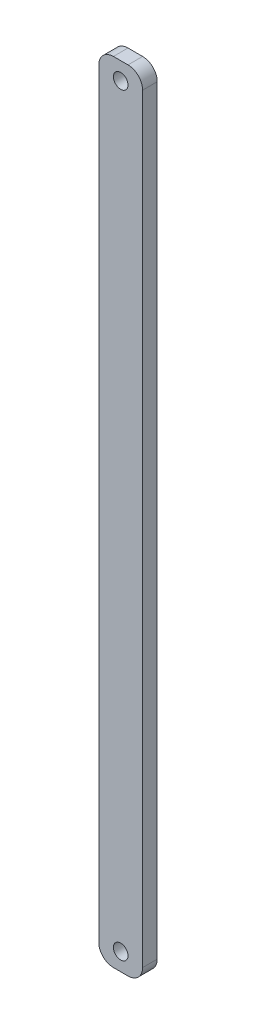
ISO-10303-21;
HEADER;
FILE_DESCRIPTION(('STEP AP214'),'2;1');
FILE_NAME('part.step','',(''),(''),'','','');
FILE_SCHEMA(('AUTOMOTIVE_DESIGN { 1 0 10303 214 1 1 1 1 }'));
ENDSEC;
DATA;
#1=APPLICATION_CONTEXT('core data for automotive mechanical design processes');
#2=APPLICATION_PROTOCOL_DEFINITION('international standard','automotive_design',2000,#1);
#3=PRODUCT_CONTEXT('',#1,'mechanical');
#4=PRODUCT('Part','Part','',(#3));
#5=PRODUCT_RELATED_PRODUCT_CATEGORY('part','',(#4));
#6=PRODUCT_DEFINITION_FORMATION('','',#4);
#7=PRODUCT_DEFINITION_CONTEXT('part definition',#1,'design');
#8=PRODUCT_DEFINITION('design','',#6,#7);
#9=PRODUCT_DEFINITION_SHAPE('','',#8);
#10=(LENGTH_UNIT() NAMED_UNIT(*) SI_UNIT(.MILLI.,.METRE.));
#11=(NAMED_UNIT(*) PLANE_ANGLE_UNIT() SI_UNIT($,.RADIAN.));
#12=(NAMED_UNIT(*) SI_UNIT($,.STERADIAN.) SOLID_ANGLE_UNIT());
#13=UNCERTAINTY_MEASURE_WITH_UNIT(LENGTH_MEASURE(1.E-05),#10,'distance_accuracy_value','');
#14=(GEOMETRIC_REPRESENTATION_CONTEXT(3) GLOBAL_UNCERTAINTY_ASSIGNED_CONTEXT((#13)) GLOBAL_UNIT_ASSIGNED_CONTEXT((#10,
#11,#12)) REPRESENTATION_CONTEXT('',''));
#15=CARTESIAN_POINT('',(0.,0.,0.));
#16=DIRECTION('',(0.,0.,1.));
#17=DIRECTION('',(1.,0.,0.));
#18=AXIS2_PLACEMENT_3D('',#15,#16,#17);
#19=CARTESIAN_POINT('',(2.00000000000001,-26.,1.));
#20=DIRECTION('',(0.,0.,-1.));
#21=DIRECTION('',(-1.,0.,0.));
#22=AXIS2_PLACEMENT_3D('',#19,#20,#21);
#23=PLANE('',#22);
#24=DIRECTION('',(1.,0.,0.));
#25=VECTOR('',#24,1.);
#26=CARTESIAN_POINT('',(1.,-27.,1.));
#27=LINE('',#26,#25);
#28=CARTESIAN_POINT('',(1.,-27.,1.));
#29=VERTEX_POINT('',#28);
#30=CARTESIAN_POINT('',(2.00000000000001,-27.,1.));
#31=VERTEX_POINT('',#30);
#32=EDGE_CURVE('E92',#29,#31,#27,.T.);
#33=ORIENTED_EDGE('',*,*,#32,.T.);
#34=CARTESIAN_POINT('',(2.00000000000001,-26.,1.));
#35=DIRECTION('',(0.,0.,1.));
#36=DIRECTION('',(-1.,0.,0.));
#37=AXIS2_PLACEMENT_3D('',#34,#35,#36);
#38=CIRCLE('',#37,1.);
#39=CARTESIAN_POINT('',(3.00000000000001,-26.,1.));
#40=VERTEX_POINT('',#39);
#41=EDGE_CURVE('E177',#31,#40,#38,.T.);
#42=ORIENTED_EDGE('',*,*,#41,.T.);
#43=DIRECTION('',(0.,1.,0.));
#44=VECTOR('',#43,1.);
#45=CARTESIAN_POINT('',(3.,26.,1.));
#46=LINE('',#45,#44);
#47=CARTESIAN_POINT('',(3.,26.,1.));
#48=VERTEX_POINT('',#47);
#49=EDGE_CURVE('E160',#40,#48,#46,.T.);
#50=ORIENTED_EDGE('',*,*,#49,.T.);
#51=CARTESIAN_POINT('',(2.,26.,1.));
#52=DIRECTION('',(0.,0.,1.));
#53=DIRECTION('',(1.,0.,0.));
#54=AXIS2_PLACEMENT_3D('',#51,#52,#53);
#55=CIRCLE('',#54,1.);
#56=CARTESIAN_POINT('',(2.,27.,1.));
#57=VERTEX_POINT('',#56);
#58=EDGE_CURVE('E173',#48,#57,#55,.T.);
#59=ORIENTED_EDGE('',*,*,#58,.T.);
#60=DIRECTION('',(-1.,0.,0.));
#61=VECTOR('',#60,1.);
#62=CARTESIAN_POINT('',(1.,27.,1.));
#63=LINE('',#62,#61);
#64=CARTESIAN_POINT('',(1.,27.,1.));
#65=VERTEX_POINT('',#64);
#66=EDGE_CURVE('E112',#57,#65,#63,.T.);
#67=ORIENTED_EDGE('',*,*,#66,.T.);
#68=CARTESIAN_POINT('',(1.,26.,1.));
#69=DIRECTION('',(0.,0.,1.));
#70=DIRECTION('',(-1.,0.,0.));
#71=AXIS2_PLACEMENT_3D('',#68,#69,#70);
#72=CIRCLE('',#71,1.);
#73=CARTESIAN_POINT('',(0.,26.,1.));
#74=VERTEX_POINT('',#73);
#75=EDGE_CURVE('E106',#65,#74,#72,.T.);
#76=ORIENTED_EDGE('',*,*,#75,.T.);
#77=DIRECTION('',(0.,-1.,0.));
#78=VECTOR('',#77,1.);
#79=CARTESIAN_POINT('',(0.,-26.,1.));
#80=LINE('',#79,#78);
#81=CARTESIAN_POINT('',(0.,-26.,1.));
#82=VERTEX_POINT('',#81);
#83=EDGE_CURVE('E110',#74,#82,#80,.T.);
#84=ORIENTED_EDGE('',*,*,#83,.T.);
#85=CARTESIAN_POINT('',(1.,-26.,1.));
#86=DIRECTION('',(0.,0.,1.));
#87=DIRECTION('',(1.,0.,0.));
#88=AXIS2_PLACEMENT_3D('',#85,#86,#87);
#89=CIRCLE('',#88,1.);
#90=EDGE_CURVE('E50',#82,#29,#89,.T.);
#91=ORIENTED_EDGE('',*,*,#90,.T.);
#92=EDGE_LOOP('',(#33,#42,#50,#59,#67,#76,#84,#91));
#93=FACE_BOUND('',#92,.T.);
#94=CARTESIAN_POINT('',(1.5,25.8,1.));
#95=DIRECTION('',(0.,0.,1.));
#96=DIRECTION('',(1.,0.,0.));
#97=AXIS2_PLACEMENT_3D('',#94,#95,#96);
#98=CIRCLE('',#97,0.5);
#99=CARTESIAN_POINT('',(2.,25.8,1.));
#100=VERTEX_POINT('',#99);
#101=EDGE_CURVE('E132',#100,#100,#98,.T.);
#102=ORIENTED_EDGE('',*,*,#101,.F.);
#103=EDGE_LOOP('',(#102));
#104=FACE_BOUND('',#103,.T.);
#105=CARTESIAN_POINT('',(1.5,-25.8,1.));
#106=DIRECTION('',(0.,0.,1.));
#107=DIRECTION('',(1.,0.,0.));
#108=AXIS2_PLACEMENT_3D('',#105,#106,#107);
#109=CIRCLE('',#108,0.5);
#110=CARTESIAN_POINT('',(2.,-25.8,1.));
#111=VERTEX_POINT('',#110);
#112=EDGE_CURVE('E183',#111,#111,#109,.T.);
#113=ORIENTED_EDGE('',*,*,#112,.F.);
#114=EDGE_LOOP('',(#113));
#115=FACE_BOUND('',#114,.T.);
#116=ADVANCED_FACE('F33',(#93,#104,#115),#23,.F.);
#117=CARTESIAN_POINT('',(2.00000000000001,-26.,0.));
#118=DIRECTION('',(0.,0.,-1.));
#119=DIRECTION('',(-1.,0.,0.));
#120=AXIS2_PLACEMENT_3D('',#117,#118,#119);
#121=PLANE('',#120);
#122=CARTESIAN_POINT('',(1.5,25.8,0.));
#123=DIRECTION('',(0.,0.,1.));
#124=DIRECTION('',(1.,0.,0.));
#125=AXIS2_PLACEMENT_3D('',#122,#123,#124);
#126=CIRCLE('',#125,0.5);
#127=CARTESIAN_POINT('',(2.,25.8,0.));
#128=VERTEX_POINT('',#127);
#129=EDGE_CURVE('E180',#128,#128,#126,.T.);
#130=ORIENTED_EDGE('',*,*,#129,.T.);
#131=EDGE_LOOP('',(#130));
#132=FACE_BOUND('',#131,.T.);
#133=DIRECTION('',(1.,0.,0.));
#134=VECTOR('',#133,1.);
#135=CARTESIAN_POINT('',(2.00000000000001,-27.,0.));
#136=LINE('',#135,#134);
#137=CARTESIAN_POINT('',(1.,-27.,0.));
#138=VERTEX_POINT('',#137);
#139=CARTESIAN_POINT('',(2.00000000000001,-27.,0.));
#140=VERTEX_POINT('',#139);
#141=EDGE_CURVE('E86',#138,#140,#136,.T.);
#142=ORIENTED_EDGE('',*,*,#141,.F.);
#143=CARTESIAN_POINT('',(1.,-26.,0.));
#144=DIRECTION('',(0.,0.,1.));
#145=DIRECTION('',(1.,0.,0.));
#146=AXIS2_PLACEMENT_3D('',#143,#144,#145);
#147=CIRCLE('',#146,1.);
#148=CARTESIAN_POINT('',(0.,-26.,0.));
#149=VERTEX_POINT('',#148);
#150=EDGE_CURVE('E142',#149,#138,#147,.T.);
#151=ORIENTED_EDGE('',*,*,#150,.F.);
#152=DIRECTION('',(0.,-1.,0.));
#153=VECTOR('',#152,1.);
#154=CARTESIAN_POINT('',(0.,-26.,0.));
#155=LINE('',#154,#153);
#156=CARTESIAN_POINT('',(0.,26.,0.));
#157=VERTEX_POINT('',#156);
#158=EDGE_CURVE('E79',#157,#149,#155,.T.);
#159=ORIENTED_EDGE('',*,*,#158,.F.);
#160=CARTESIAN_POINT('',(1.,26.,0.));
#161=DIRECTION('',(0.,0.,1.));
#162=DIRECTION('',(-1.,0.,0.));
#163=AXIS2_PLACEMENT_3D('',#160,#161,#162);
#164=CIRCLE('',#163,1.);
#165=CARTESIAN_POINT('',(1.,27.,0.));
#166=VERTEX_POINT('',#165);
#167=EDGE_CURVE('E120',#166,#157,#164,.T.);
#168=ORIENTED_EDGE('',*,*,#167,.F.);
#169=DIRECTION('',(-1.,0.,0.));
#170=VECTOR('',#169,1.);
#171=CARTESIAN_POINT('',(1.,27.,0.));
#172=LINE('',#171,#170);
#173=CARTESIAN_POINT('',(2.,27.,0.));
#174=VERTEX_POINT('',#173);
#175=EDGE_CURVE('E138',#174,#166,#172,.T.);
#176=ORIENTED_EDGE('',*,*,#175,.F.);
#177=CARTESIAN_POINT('',(2.,26.,0.));
#178=DIRECTION('',(0.,0.,1.));
#179=DIRECTION('',(1.,0.,0.));
#180=AXIS2_PLACEMENT_3D('',#177,#178,#179);
#181=CIRCLE('',#180,1.);
#182=CARTESIAN_POINT('',(3.,26.,0.));
#183=VERTEX_POINT('',#182);
#184=EDGE_CURVE('E136',#183,#174,#181,.T.);
#185=ORIENTED_EDGE('',*,*,#184,.F.);
#186=DIRECTION('',(0.,1.,0.));
#187=VECTOR('',#186,1.);
#188=CARTESIAN_POINT('',(3.,26.,0.));
#189=LINE('',#188,#187);
#190=CARTESIAN_POINT('',(3.00000000000001,-26.,0.));
#191=VERTEX_POINT('',#190);
#192=EDGE_CURVE('E134',#191,#183,#189,.T.);
#193=ORIENTED_EDGE('',*,*,#192,.F.);
#194=CARTESIAN_POINT('',(2.00000000000001,-26.,0.));
#195=DIRECTION('',(0.,0.,1.));
#196=DIRECTION('',(-1.,0.,0.));
#197=AXIS2_PLACEMENT_3D('',#194,#195,#196);
#198=CIRCLE('',#197,1.);
#199=EDGE_CURVE('E131',#140,#191,#198,.T.);
#200=ORIENTED_EDGE('',*,*,#199,.F.);
#201=EDGE_LOOP('',(#142,#151,#159,#168,#176,#185,#193,#200));
#202=FACE_BOUND('',#201,.T.);
#203=CARTESIAN_POINT('',(1.5,-25.8,0.));
#204=DIRECTION('',(0.,0.,1.));
#205=DIRECTION('',(1.,0.,0.));
#206=AXIS2_PLACEMENT_3D('',#203,#204,#205);
#207=CIRCLE('',#206,0.5);
#208=CARTESIAN_POINT('',(2.,-25.8,0.));
#209=VERTEX_POINT('',#208);
#210=EDGE_CURVE('E186',#209,#209,#207,.T.);
#211=ORIENTED_EDGE('',*,*,#210,.T.);
#212=EDGE_LOOP('',(#211));
#213=FACE_BOUND('',#212,.T.);
#214=ADVANCED_FACE('F164',(#132,#202,#213),#121,.T.);
#215=CARTESIAN_POINT('',(2.00000000000001,-27.,1.));
#216=DIRECTION('',(0.,1.,0.));
#217=DIRECTION('',(0.,0.,1.));
#218=AXIS2_PLACEMENT_3D('',#215,#216,#217);
#219=PLANE('',#218);
#220=ORIENTED_EDGE('',*,*,#141,.T.);
#221=DIRECTION('',(0.,0.,-1.));
#222=VECTOR('',#221,1.);
#223=CARTESIAN_POINT('',(2.00000000000001,-27.,1.));
#224=LINE('',#223,#222);
#225=EDGE_CURVE('E11',#31,#140,#224,.T.);
#226=ORIENTED_EDGE('',*,*,#225,.F.);
#227=ORIENTED_EDGE('',*,*,#32,.F.);
#228=DIRECTION('',(0.,0.,-1.));
#229=VECTOR('',#228,1.);
#230=CARTESIAN_POINT('',(1.,-27.,1.));
#231=LINE('',#230,#229);
#232=EDGE_CURVE('E126',#29,#138,#231,.T.);
#233=ORIENTED_EDGE('',*,*,#232,.T.);
#234=EDGE_LOOP('',(#220,#226,#227,#233));
#235=FACE_BOUND('',#234,.T.);
#236=ADVANCED_FACE('F35',(#235),#219,.F.);
#237=CARTESIAN_POINT('',(2.00000000000001,-26.,1.));
#238=DIRECTION('',(0.,0.,-1.));
#239=DIRECTION('',(-1.,0.,0.));
#240=AXIS2_PLACEMENT_3D('',#237,#238,#239);
#241=CYLINDRICAL_SURFACE('',#240,1.);
#242=ORIENTED_EDGE('',*,*,#199,.T.);
#243=DIRECTION('',(0.,0.,-1.));
#244=VECTOR('',#243,1.);
#245=CARTESIAN_POINT('',(3.00000000000001,-26.,1.));
#246=LINE('',#245,#244);
#247=EDGE_CURVE('E42',#40,#191,#246,.T.);
#248=ORIENTED_EDGE('',*,*,#247,.F.);
#249=ORIENTED_EDGE('',*,*,#41,.F.);
#250=ORIENTED_EDGE('',*,*,#225,.T.);
#251=EDGE_LOOP('',(#242,#248,#249,#250));
#252=FACE_BOUND('',#251,.T.);
#253=ADVANCED_FACE('F219',(#252),#241,.T.);
#254=CARTESIAN_POINT('',(3.,26.,1.));
#255=DIRECTION('',(-1.,0.,0.));
#256=DIRECTION('',(0.,-1.,0.));
#257=AXIS2_PLACEMENT_3D('',#254,#255,#256);
#258=PLANE('',#257);
#259=ORIENTED_EDGE('',*,*,#192,.T.);
#260=DIRECTION('',(0.,0.,-1.));
#261=VECTOR('',#260,1.);
#262=CARTESIAN_POINT('',(3.,26.,1.));
#263=LINE('',#262,#261);
#264=EDGE_CURVE('E151',#48,#183,#263,.T.);
#265=ORIENTED_EDGE('',*,*,#264,.F.);
#266=ORIENTED_EDGE('',*,*,#49,.F.);
#267=ORIENTED_EDGE('',*,*,#247,.T.);
#268=EDGE_LOOP('',(#259,#265,#266,#267));
#269=FACE_BOUND('',#268,.T.);
#270=ADVANCED_FACE('F158',(#269),#258,.F.);
#271=CARTESIAN_POINT('',(2.,26.,1.));
#272=DIRECTION('',(0.,0.,-1.));
#273=DIRECTION('',(-1.,0.,0.));
#274=AXIS2_PLACEMENT_3D('',#271,#272,#273);
#275=CYLINDRICAL_SURFACE('',#274,1.);
#276=ORIENTED_EDGE('',*,*,#184,.T.);
#277=DIRECTION('',(0.,0.,-1.));
#278=VECTOR('',#277,1.);
#279=CARTESIAN_POINT('',(2.,27.,1.));
#280=LINE('',#279,#278);
#281=EDGE_CURVE('E148',#57,#174,#280,.T.);
#282=ORIENTED_EDGE('',*,*,#281,.F.);
#283=ORIENTED_EDGE('',*,*,#58,.F.);
#284=ORIENTED_EDGE('',*,*,#264,.T.);
#285=EDGE_LOOP('',(#276,#282,#283,#284));
#286=FACE_BOUND('',#285,.T.);
#287=ADVANCED_FACE('F169',(#286),#275,.T.);
#288=CARTESIAN_POINT('',(1.,27.,1.));
#289=DIRECTION('',(0.,-1.,0.));
#290=DIRECTION('',(0.,0.,-1.));
#291=AXIS2_PLACEMENT_3D('',#288,#289,#290);
#292=PLANE('',#291);
#293=ORIENTED_EDGE('',*,*,#175,.T.);
#294=DIRECTION('',(0.,0.,-1.));
#295=VECTOR('',#294,1.);
#296=CARTESIAN_POINT('',(1.,27.,1.));
#297=LINE('',#296,#295);
#298=EDGE_CURVE('E121',#65,#166,#297,.T.);
#299=ORIENTED_EDGE('',*,*,#298,.F.);
#300=ORIENTED_EDGE('',*,*,#66,.F.);
#301=ORIENTED_EDGE('',*,*,#281,.T.);
#302=EDGE_LOOP('',(#293,#299,#300,#301));
#303=FACE_BOUND('',#302,.T.);
#304=ADVANCED_FACE('F172',(#303),#292,.F.);
#305=CARTESIAN_POINT('',(1.,26.,1.));
#306=DIRECTION('',(0.,0.,-1.));
#307=DIRECTION('',(-1.,0.,0.));
#308=AXIS2_PLACEMENT_3D('',#305,#306,#307);
#309=CYLINDRICAL_SURFACE('',#308,1.);
#310=ORIENTED_EDGE('',*,*,#167,.T.);
#311=DIRECTION('',(0.,0.,-1.));
#312=VECTOR('',#311,1.);
#313=CARTESIAN_POINT('',(0.,26.,1.));
#314=LINE('',#313,#312);
#315=EDGE_CURVE('E117',#74,#157,#314,.T.);
#316=ORIENTED_EDGE('',*,*,#315,.F.);
#317=ORIENTED_EDGE('',*,*,#75,.F.);
#318=ORIENTED_EDGE('',*,*,#298,.T.);
#319=EDGE_LOOP('',(#310,#316,#317,#318));
#320=FACE_BOUND('',#319,.T.);
#321=ADVANCED_FACE('F118',(#320),#309,.T.);
#322=CARTESIAN_POINT('',(0.,-26.,1.));
#323=DIRECTION('',(1.,0.,0.));
#324=DIRECTION('',(0.,1.,0.));
#325=AXIS2_PLACEMENT_3D('',#322,#323,#324);
#326=PLANE('',#325);
#327=ORIENTED_EDGE('',*,*,#158,.T.);
#328=DIRECTION('',(0.,0.,-1.));
#329=VECTOR('',#328,1.);
#330=CARTESIAN_POINT('',(0.,-26.,1.));
#331=LINE('',#330,#329);
#332=EDGE_CURVE('E122',#82,#149,#331,.T.);
#333=ORIENTED_EDGE('',*,*,#332,.F.);
#334=ORIENTED_EDGE('',*,*,#83,.F.);
#335=ORIENTED_EDGE('',*,*,#315,.T.);
#336=EDGE_LOOP('',(#327,#333,#334,#335));
#337=FACE_BOUND('',#336,.T.);
#338=ADVANCED_FACE('F124',(#337),#326,.F.);
#339=CARTESIAN_POINT('',(1.,-26.,1.));
#340=DIRECTION('',(0.,0.,-1.));
#341=DIRECTION('',(-1.,0.,0.));
#342=AXIS2_PLACEMENT_3D('',#339,#340,#341);
#343=CYLINDRICAL_SURFACE('',#342,1.);
#344=ORIENTED_EDGE('',*,*,#150,.T.);
#345=ORIENTED_EDGE('',*,*,#232,.F.);
#346=ORIENTED_EDGE('',*,*,#90,.F.);
#347=ORIENTED_EDGE('',*,*,#332,.T.);
#348=EDGE_LOOP('',(#344,#345,#346,#347));
#349=FACE_BOUND('',#348,.T.);
#350=ADVANCED_FACE('F206',(#349),#343,.T.);
#351=CARTESIAN_POINT('',(1.5,25.8,1.));
#352=DIRECTION('',(0.,0.,-1.));
#353=DIRECTION('',(-1.,0.,0.));
#354=AXIS2_PLACEMENT_3D('',#351,#352,#353);
#355=CYLINDRICAL_SURFACE('',#354,0.5);
#356=ORIENTED_EDGE('',*,*,#101,.T.);
#357=EDGE_LOOP('',(#356));
#358=FACE_BOUND('',#357,.T.);
#359=ORIENTED_EDGE('',*,*,#129,.F.);
#360=EDGE_LOOP('',(#359));
#361=FACE_BOUND('',#360,.T.);
#362=ADVANCED_FACE('F203',(#358,#361),#355,.F.);
#363=CARTESIAN_POINT('',(1.5,-25.8,1.));
#364=DIRECTION('',(0.,0.,-1.));
#365=DIRECTION('',(-1.,0.,0.));
#366=AXIS2_PLACEMENT_3D('',#363,#364,#365);
#367=CYLINDRICAL_SURFACE('',#366,0.5);
#368=ORIENTED_EDGE('',*,*,#112,.T.);
#369=EDGE_LOOP('',(#368));
#370=FACE_BOUND('',#369,.T.);
#371=ORIENTED_EDGE('',*,*,#210,.F.);
#372=EDGE_LOOP('',(#371));
#373=FACE_BOUND('',#372,.T.);
#374=ADVANCED_FACE('F192',(#370,#373),#367,.F.);
#375=CLOSED_SHELL('',(#116,#214,#236,#253,#270,#287,#304,#321,#338,#350,#362,#374));
#376=MANIFOLD_SOLID_BREP('B2',#375);
#377=ADVANCED_BREP_SHAPE_REPRESENTATION('',(#18,#376),#14);
#378=SHAPE_DEFINITION_REPRESENTATION(#9,#377);
ENDSEC;
END-ISO-10303-21;
